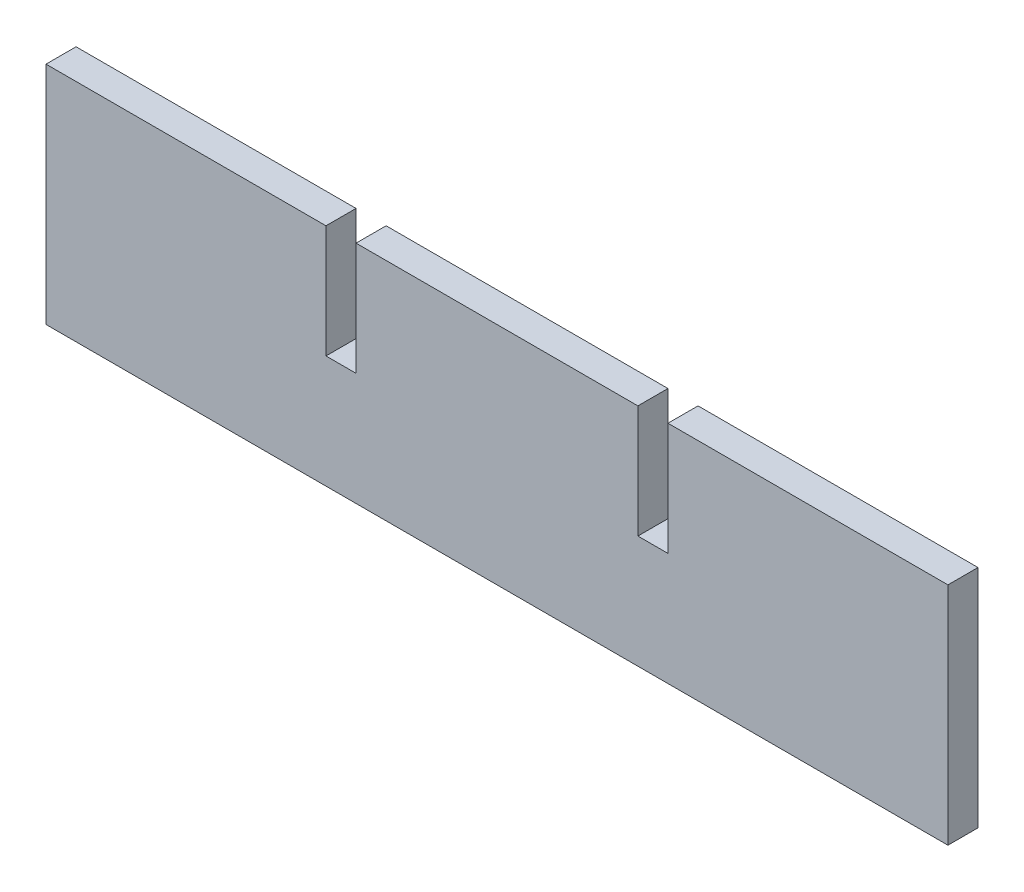
ISO-10303-21;
HEADER;
FILE_DESCRIPTION(('STEP AP214'),'2;1');
FILE_NAME('part.step','',(''),(''),'','','');
FILE_SCHEMA(('AUTOMOTIVE_DESIGN { 1 0 10303 214 1 1 1 1 }'));
ENDSEC;
DATA;
#1=APPLICATION_CONTEXT('core data for automotive mechanical design processes');
#2=APPLICATION_PROTOCOL_DEFINITION('international standard','automotive_design',2000,#1);
#3=PRODUCT_CONTEXT('',#1,'mechanical');
#4=PRODUCT('Part','Part','',(#3));
#5=PRODUCT_RELATED_PRODUCT_CATEGORY('part','',(#4));
#6=PRODUCT_DEFINITION_FORMATION('','',#4);
#7=PRODUCT_DEFINITION_CONTEXT('part definition',#1,'design');
#8=PRODUCT_DEFINITION('design','',#6,#7);
#9=PRODUCT_DEFINITION_SHAPE('','',#8);
#10=(LENGTH_UNIT() NAMED_UNIT(*) SI_UNIT(.MILLI.,.METRE.));
#11=(NAMED_UNIT(*) PLANE_ANGLE_UNIT() SI_UNIT($,.RADIAN.));
#12=(NAMED_UNIT(*) SI_UNIT($,.STERADIAN.) SOLID_ANGLE_UNIT());
#13=UNCERTAINTY_MEASURE_WITH_UNIT(LENGTH_MEASURE(1.E-05),#10,'distance_accuracy_value','');
#14=(GEOMETRIC_REPRESENTATION_CONTEXT(3) GLOBAL_UNCERTAINTY_ASSIGNED_CONTEXT((#13)) GLOBAL_UNIT_ASSIGNED_CONTEXT((#10,
#11,#12)) REPRESENTATION_CONTEXT('',''));
#15=CARTESIAN_POINT('',(0.,0.,0.));
#16=DIRECTION('',(0.,0.,1.));
#17=DIRECTION('',(1.,0.,0.));
#18=AXIS2_PLACEMENT_3D('',#15,#16,#17);
#19=CARTESIAN_POINT('',(-120.,0.,8.));
#20=DIRECTION('',(1.,0.,0.));
#21=DIRECTION('',(0.,0.,-1.));
#22=AXIS2_PLACEMENT_3D('',#19,#20,#21);
#23=PLANE('',#22);
#24=DIRECTION('',(0.,-1.,0.));
#25=VECTOR('',#24,1.);
#26=CARTESIAN_POINT('',(-120.,0.,0.));
#27=LINE('',#26,#25);
#28=CARTESIAN_POINT('',(-120.,60.,0.));
#29=VERTEX_POINT('',#28);
#30=CARTESIAN_POINT('',(-120.,0.,0.));
#31=VERTEX_POINT('',#30);
#32=EDGE_CURVE('E153',#29,#31,#27,.T.);
#33=ORIENTED_EDGE('',*,*,#32,.T.);
#34=DIRECTION('',(0.,0.,-1.));
#35=VECTOR('',#34,1.);
#36=CARTESIAN_POINT('',(-120.,0.,8.));
#37=LINE('',#36,#35);
#38=CARTESIAN_POINT('',(-120.,0.,8.));
#39=VERTEX_POINT('',#38);
#40=EDGE_CURVE('E11',#39,#31,#37,.T.);
#41=ORIENTED_EDGE('',*,*,#40,.F.);
#42=DIRECTION('',(0.,-1.,0.));
#43=VECTOR('',#42,1.);
#44=CARTESIAN_POINT('',(-120.,0.,8.));
#45=LINE('',#44,#43);
#46=CARTESIAN_POINT('',(-120.,60.,8.));
#47=VERTEX_POINT('',#46);
#48=EDGE_CURVE('E175',#47,#39,#45,.T.);
#49=ORIENTED_EDGE('',*,*,#48,.F.);
#50=DIRECTION('',(0.,0.,-1.));
#51=VECTOR('',#50,1.);
#52=CARTESIAN_POINT('',(-120.,60.,8.));
#53=LINE('',#52,#51);
#54=EDGE_CURVE('E149',#47,#29,#53,.T.);
#55=ORIENTED_EDGE('',*,*,#54,.T.);
#56=EDGE_LOOP('',(#33,#41,#49,#55));
#57=FACE_BOUND('',#56,.T.);
#58=ADVANCED_FACE('F33',(#57),#23,.F.);
#59=CARTESIAN_POINT('',(120.,0.,8.));
#60=DIRECTION('',(0.,1.,0.));
#61=DIRECTION('',(0.,0.,1.));
#62=AXIS2_PLACEMENT_3D('',#59,#60,#61);
#63=PLANE('',#62);
#64=DIRECTION('',(1.,0.,0.));
#65=VECTOR('',#64,1.);
#66=CARTESIAN_POINT('',(120.,0.,0.));
#67=LINE('',#66,#65);
#68=CARTESIAN_POINT('',(120.,0.,0.));
#69=VERTEX_POINT('',#68);
#70=EDGE_CURVE('E156',#31,#69,#67,.T.);
#71=ORIENTED_EDGE('',*,*,#70,.T.);
#72=DIRECTION('',(0.,0.,-1.));
#73=VECTOR('',#72,1.);
#74=CARTESIAN_POINT('',(120.,0.,8.));
#75=LINE('',#74,#73);
#76=CARTESIAN_POINT('',(120.,0.,8.));
#77=VERTEX_POINT('',#76);
#78=EDGE_CURVE('E41',#77,#69,#75,.T.);
#79=ORIENTED_EDGE('',*,*,#78,.F.);
#80=DIRECTION('',(1.,0.,0.));
#81=VECTOR('',#80,1.);
#82=CARTESIAN_POINT('',(120.,0.,8.));
#83=LINE('',#82,#81);
#84=EDGE_CURVE('E104',#39,#77,#83,.T.);
#85=ORIENTED_EDGE('',*,*,#84,.F.);
#86=ORIENTED_EDGE('',*,*,#40,.T.);
#87=EDGE_LOOP('',(#71,#79,#85,#86));
#88=FACE_BOUND('',#87,.T.);
#89=ADVANCED_FACE('F253',(#88),#63,.F.);
#90=CARTESIAN_POINT('',(120.,0.,8.));
#91=DIRECTION('',(-1.,0.,0.));
#92=DIRECTION('',(0.,0.,1.));
#93=AXIS2_PLACEMENT_3D('',#90,#91,#92);
#94=PLANE('',#93);
#95=DIRECTION('',(0.,1.,0.));
#96=VECTOR('',#95,1.);
#97=CARTESIAN_POINT('',(120.,0.,0.));
#98=LINE('',#97,#96);
#99=CARTESIAN_POINT('',(120.,60.,0.));
#100=VERTEX_POINT('',#99);
#101=EDGE_CURVE('E158',#69,#100,#98,.T.);
#102=ORIENTED_EDGE('',*,*,#101,.T.);
#103=DIRECTION('',(0.,0.,-1.));
#104=VECTOR('',#103,1.);
#105=CARTESIAN_POINT('',(120.,60.,8.));
#106=LINE('',#105,#104);
#107=CARTESIAN_POINT('',(120.,60.,8.));
#108=VERTEX_POINT('',#107);
#109=EDGE_CURVE('E194',#108,#100,#106,.T.);
#110=ORIENTED_EDGE('',*,*,#109,.F.);
#111=DIRECTION('',(0.,1.,0.));
#112=VECTOR('',#111,1.);
#113=CARTESIAN_POINT('',(120.,0.,8.));
#114=LINE('',#113,#112);
#115=EDGE_CURVE('E202',#77,#108,#114,.T.);
#116=ORIENTED_EDGE('',*,*,#115,.F.);
#117=ORIENTED_EDGE('',*,*,#78,.T.);
#118=EDGE_LOOP('',(#102,#110,#116,#117));
#119=FACE_BOUND('',#118,.T.);
#120=ADVANCED_FACE('F200',(#119),#94,.F.);
#121=CARTESIAN_POINT('',(120.,60.,8.));
#122=DIRECTION('',(0.,-1.,0.));
#123=DIRECTION('',(1.,0.,0.));
#124=AXIS2_PLACEMENT_3D('',#121,#122,#123);
#125=PLANE('',#124);
#126=DIRECTION('',(-1.,0.,0.));
#127=VECTOR('',#126,1.);
#128=CARTESIAN_POINT('',(120.,60.,0.));
#129=LINE('',#128,#127);
#130=CARTESIAN_POINT('',(45.5,60.0000000000002,0.));
#131=VERTEX_POINT('',#130);
#132=EDGE_CURVE('E160',#100,#131,#129,.T.);
#133=ORIENTED_EDGE('',*,*,#132,.T.);
#134=DIRECTION('',(0.,0.,-1.));
#135=VECTOR('',#134,1.);
#136=CARTESIAN_POINT('',(45.5,60.0000000000002,8.));
#137=LINE('',#136,#135);
#138=CARTESIAN_POINT('',(45.5,60.0000000000002,8.));
#139=VERTEX_POINT('',#138);
#140=EDGE_CURVE('E191',#139,#131,#137,.T.);
#141=ORIENTED_EDGE('',*,*,#140,.F.);
#142=DIRECTION('',(-1.,0.,0.));
#143=VECTOR('',#142,1.);
#144=CARTESIAN_POINT('',(120.,60.,8.));
#145=LINE('',#144,#143);
#146=EDGE_CURVE('E220',#108,#139,#145,.T.);
#147=ORIENTED_EDGE('',*,*,#146,.F.);
#148=ORIENTED_EDGE('',*,*,#109,.T.);
#149=EDGE_LOOP('',(#133,#141,#147,#148));
#150=FACE_BOUND('',#149,.T.);
#151=ADVANCED_FACE('F211',(#150),#125,.F.);
#152=CARTESIAN_POINT('',(45.5,60.0000000000002,8.));
#153=DIRECTION('',(1.,0.,0.));
#154=DIRECTION('',(0.,1.,0.));
#155=AXIS2_PLACEMENT_3D('',#152,#153,#154);
#156=PLANE('',#155);
#157=DIRECTION('',(0.,-1.,0.));
#158=VECTOR('',#157,1.);
#159=CARTESIAN_POINT('',(45.5,60.0000000000002,0.));
#160=LINE('',#159,#158);
#161=CARTESIAN_POINT('',(45.5,30.0000000000002,0.));
#162=VERTEX_POINT('',#161);
#163=EDGE_CURVE('E162',#131,#162,#160,.T.);
#164=ORIENTED_EDGE('',*,*,#163,.T.);
#165=DIRECTION('',(0.,0.,-1.));
#166=VECTOR('',#165,1.);
#167=CARTESIAN_POINT('',(45.5,30.0000000000002,8.));
#168=LINE('',#167,#166);
#169=CARTESIAN_POINT('',(45.5,30.0000000000002,8.));
#170=VERTEX_POINT('',#169);
#171=EDGE_CURVE('E188',#170,#162,#168,.T.);
#172=ORIENTED_EDGE('',*,*,#171,.F.);
#173=DIRECTION('',(0.,-1.,0.));
#174=VECTOR('',#173,1.);
#175=CARTESIAN_POINT('',(45.5,60.0000000000002,8.));
#176=LINE('',#175,#174);
#177=EDGE_CURVE('E217',#139,#170,#176,.T.);
#178=ORIENTED_EDGE('',*,*,#177,.F.);
#179=ORIENTED_EDGE('',*,*,#140,.T.);
#180=EDGE_LOOP('',(#164,#172,#178,#179));
#181=FACE_BOUND('',#180,.T.);
#182=ADVANCED_FACE('F215',(#181),#156,.F.);
#183=CARTESIAN_POINT('',(45.5,30.0000000000002,8.));
#184=DIRECTION('',(0.,-1.,0.));
#185=DIRECTION('',(0.,0.,-1.));
#186=AXIS2_PLACEMENT_3D('',#183,#184,#185);
#187=PLANE('',#186);
#188=DIRECTION('',(-1.,0.,0.));
#189=VECTOR('',#188,1.);
#190=CARTESIAN_POINT('',(45.5,30.0000000000002,0.));
#191=LINE('',#190,#189);
#192=CARTESIAN_POINT('',(37.5,30.0000000000002,0.));
#193=VERTEX_POINT('',#192);
#194=EDGE_CURVE('E164',#162,#193,#191,.T.);
#195=ORIENTED_EDGE('',*,*,#194,.T.);
#196=DIRECTION('',(0.,0.,-1.));
#197=VECTOR('',#196,1.);
#198=CARTESIAN_POINT('',(37.5,30.0000000000002,8.));
#199=LINE('',#198,#197);
#200=CARTESIAN_POINT('',(37.5,30.0000000000002,8.));
#201=VERTEX_POINT('',#200);
#202=EDGE_CURVE('E185',#201,#193,#199,.T.);
#203=ORIENTED_EDGE('',*,*,#202,.F.);
#204=DIRECTION('',(-1.,0.,0.));
#205=VECTOR('',#204,1.);
#206=CARTESIAN_POINT('',(45.5,30.0000000000002,8.));
#207=LINE('',#206,#205);
#208=EDGE_CURVE('E219',#170,#201,#207,.T.);
#209=ORIENTED_EDGE('',*,*,#208,.F.);
#210=ORIENTED_EDGE('',*,*,#171,.T.);
#211=EDGE_LOOP('',(#195,#203,#209,#210));
#212=FACE_BOUND('',#211,.T.);
#213=ADVANCED_FACE('F266',(#212),#187,.F.);
#214=CARTESIAN_POINT('',(37.5,30.0000000000002,8.));
#215=DIRECTION('',(-1.,0.,0.));
#216=DIRECTION('',(0.,-1.,0.));
#217=AXIS2_PLACEMENT_3D('',#214,#215,#216);
#218=PLANE('',#217);
#219=DIRECTION('',(0.,1.,0.));
#220=VECTOR('',#219,1.);
#221=CARTESIAN_POINT('',(37.5,30.0000000000002,0.));
#222=LINE('',#221,#220);
#223=CARTESIAN_POINT('',(37.5,60.0000000000002,0.));
#224=VERTEX_POINT('',#223);
#225=EDGE_CURVE('E166',#193,#224,#222,.T.);
#226=ORIENTED_EDGE('',*,*,#225,.T.);
#227=DIRECTION('',(0.,0.,-1.));
#228=VECTOR('',#227,1.);
#229=CARTESIAN_POINT('',(37.5,60.0000000000002,8.));
#230=LINE('',#229,#228);
#231=CARTESIAN_POINT('',(37.5,60.0000000000002,8.));
#232=VERTEX_POINT('',#231);
#233=EDGE_CURVE('E182',#232,#224,#230,.T.);
#234=ORIENTED_EDGE('',*,*,#233,.F.);
#235=DIRECTION('',(0.,1.,0.));
#236=VECTOR('',#235,1.);
#237=CARTESIAN_POINT('',(37.5,30.0000000000002,8.));
#238=LINE('',#237,#236);
#239=EDGE_CURVE('E222',#201,#232,#238,.T.);
#240=ORIENTED_EDGE('',*,*,#239,.F.);
#241=ORIENTED_EDGE('',*,*,#202,.T.);
#242=EDGE_LOOP('',(#226,#234,#240,#241));
#243=FACE_BOUND('',#242,.T.);
#244=ADVANCED_FACE('F269',(#243),#218,.F.);
#245=CARTESIAN_POINT('',(-37.5,60.0000000000002,8.));
#246=DIRECTION('',(0.,-1.,0.));
#247=DIRECTION('',(0.,0.,-1.));
#248=AXIS2_PLACEMENT_3D('',#245,#246,#247);
#249=PLANE('',#248);
#250=DIRECTION('',(-1.,0.,0.));
#251=VECTOR('',#250,1.);
#252=CARTESIAN_POINT('',(-37.5,60.0000000000002,0.));
#253=LINE('',#252,#251);
#254=CARTESIAN_POINT('',(-37.5,60.0000000000002,0.));
#255=VERTEX_POINT('',#254);
#256=EDGE_CURVE('E168',#224,#255,#253,.T.);
#257=ORIENTED_EDGE('',*,*,#256,.T.);
#258=DIRECTION('',(0.,0.,-1.));
#259=VECTOR('',#258,1.);
#260=CARTESIAN_POINT('',(-37.5,60.0000000000002,8.));
#261=LINE('',#260,#259);
#262=CARTESIAN_POINT('',(-37.5,60.0000000000002,8.));
#263=VERTEX_POINT('',#262);
#264=EDGE_CURVE('E179',#263,#255,#261,.T.);
#265=ORIENTED_EDGE('',*,*,#264,.F.);
#266=DIRECTION('',(-1.,0.,0.));
#267=VECTOR('',#266,1.);
#268=CARTESIAN_POINT('',(-37.5,60.0000000000002,8.));
#269=LINE('',#268,#267);
#270=EDGE_CURVE('E228',#232,#263,#269,.T.);
#271=ORIENTED_EDGE('',*,*,#270,.F.);
#272=ORIENTED_EDGE('',*,*,#233,.T.);
#273=EDGE_LOOP('',(#257,#265,#271,#272));
#274=FACE_BOUND('',#273,.T.);
#275=ADVANCED_FACE('F234',(#274),#249,.F.);
#276=CARTESIAN_POINT('',(-37.5,30.0000000000002,8.));
#277=DIRECTION('',(1.,0.,0.));
#278=DIRECTION('',(0.,1.,0.));
#279=AXIS2_PLACEMENT_3D('',#276,#277,#278);
#280=PLANE('',#279);
#281=DIRECTION('',(0.,-1.,0.));
#282=VECTOR('',#281,1.);
#283=CARTESIAN_POINT('',(-37.5,30.0000000000002,0.));
#284=LINE('',#283,#282);
#285=CARTESIAN_POINT('',(-37.5,30.0000000000002,0.));
#286=VERTEX_POINT('',#285);
#287=EDGE_CURVE('E170',#255,#286,#284,.T.);
#288=ORIENTED_EDGE('',*,*,#287,.T.);
#289=DIRECTION('',(0.,0.,-1.));
#290=VECTOR('',#289,1.);
#291=CARTESIAN_POINT('',(-37.5,30.0000000000002,8.));
#292=LINE('',#291,#290);
#293=CARTESIAN_POINT('',(-37.5,30.0000000000002,8.));
#294=VERTEX_POINT('',#293);
#295=EDGE_CURVE('E144',#294,#286,#292,.T.);
#296=ORIENTED_EDGE('',*,*,#295,.F.);
#297=DIRECTION('',(0.,-1.,0.));
#298=VECTOR('',#297,1.);
#299=CARTESIAN_POINT('',(-37.5,30.0000000000002,8.));
#300=LINE('',#299,#298);
#301=EDGE_CURVE('E135',#263,#294,#300,.T.);
#302=ORIENTED_EDGE('',*,*,#301,.F.);
#303=ORIENTED_EDGE('',*,*,#264,.T.);
#304=EDGE_LOOP('',(#288,#296,#302,#303));
#305=FACE_BOUND('',#304,.T.);
#306=ADVANCED_FACE('F238',(#305),#280,.F.);
#307=CARTESIAN_POINT('',(-45.5,30.0000000000002,8.));
#308=DIRECTION('',(0.,-1.,0.));
#309=DIRECTION('',(0.,0.,-1.));
#310=AXIS2_PLACEMENT_3D('',#307,#308,#309);
#311=PLANE('',#310);
#312=DIRECTION('',(-1.,0.,0.));
#313=VECTOR('',#312,1.);
#314=CARTESIAN_POINT('',(-45.5,30.0000000000002,0.));
#315=LINE('',#314,#313);
#316=CARTESIAN_POINT('',(-45.5,30.0000000000002,0.));
#317=VERTEX_POINT('',#316);
#318=EDGE_CURVE('E143',#286,#317,#315,.T.);
#319=ORIENTED_EDGE('',*,*,#318,.T.);
#320=DIRECTION('',(0.,0.,-1.));
#321=VECTOR('',#320,1.);
#322=CARTESIAN_POINT('',(-45.5,30.0000000000002,8.));
#323=LINE('',#322,#321);
#324=CARTESIAN_POINT('',(-45.5,30.0000000000002,8.));
#325=VERTEX_POINT('',#324);
#326=EDGE_CURVE('E140',#325,#317,#323,.T.);
#327=ORIENTED_EDGE('',*,*,#326,.F.);
#328=DIRECTION('',(-1.,0.,0.));
#329=VECTOR('',#328,1.);
#330=CARTESIAN_POINT('',(-45.5,30.0000000000002,8.));
#331=LINE('',#330,#329);
#332=EDGE_CURVE('E129',#294,#325,#331,.T.);
#333=ORIENTED_EDGE('',*,*,#332,.F.);
#334=ORIENTED_EDGE('',*,*,#295,.T.);
#335=EDGE_LOOP('',(#319,#327,#333,#334));
#336=FACE_BOUND('',#335,.T.);
#337=ADVANCED_FACE('F141',(#336),#311,.F.);
#338=CARTESIAN_POINT('',(-45.5,60.0000000000002,8.));
#339=DIRECTION('',(-1.,0.,0.));
#340=DIRECTION('',(0.,-1.,0.));
#341=AXIS2_PLACEMENT_3D('',#338,#339,#340);
#342=PLANE('',#341);
#343=DIRECTION('',(0.,1.,0.));
#344=VECTOR('',#343,1.);
#345=CARTESIAN_POINT('',(-45.5,60.0000000000002,0.));
#346=LINE('',#345,#344);
#347=CARTESIAN_POINT('',(-45.5,60.0000000000002,0.));
#348=VERTEX_POINT('',#347);
#349=EDGE_CURVE('E90',#317,#348,#346,.T.);
#350=ORIENTED_EDGE('',*,*,#349,.T.);
#351=DIRECTION('',(0.,0.,-1.));
#352=VECTOR('',#351,1.);
#353=CARTESIAN_POINT('',(-45.5,60.0000000000002,8.));
#354=LINE('',#353,#352);
#355=CARTESIAN_POINT('',(-45.5,60.0000000000002,8.));
#356=VERTEX_POINT('',#355);
#357=EDGE_CURVE('E145',#356,#348,#354,.T.);
#358=ORIENTED_EDGE('',*,*,#357,.F.);
#359=DIRECTION('',(0.,1.,0.));
#360=VECTOR('',#359,1.);
#361=CARTESIAN_POINT('',(-45.5,60.0000000000002,8.));
#362=LINE('',#361,#360);
#363=EDGE_CURVE('E133',#325,#356,#362,.T.);
#364=ORIENTED_EDGE('',*,*,#363,.F.);
#365=ORIENTED_EDGE('',*,*,#326,.T.);
#366=EDGE_LOOP('',(#350,#358,#364,#365));
#367=FACE_BOUND('',#366,.T.);
#368=ADVANCED_FACE('F147',(#367),#342,.F.);
#369=CARTESIAN_POINT('',(-120.,60.,8.));
#370=DIRECTION('',(0.,-1.,0.));
#371=DIRECTION('',(1.,0.,0.));
#372=AXIS2_PLACEMENT_3D('',#369,#370,#371);
#373=PLANE('',#372);
#374=DIRECTION('',(-1.,0.,0.));
#375=VECTOR('',#374,1.);
#376=CARTESIAN_POINT('',(-120.,60.,0.));
#377=LINE('',#376,#375);
#378=EDGE_CURVE('E96',#348,#29,#377,.T.);
#379=ORIENTED_EDGE('',*,*,#378,.T.);
#380=ORIENTED_EDGE('',*,*,#54,.F.);
#381=DIRECTION('',(-1.,0.,0.));
#382=VECTOR('',#381,1.);
#383=CARTESIAN_POINT('',(-120.,60.,8.));
#384=LINE('',#383,#382);
#385=EDGE_CURVE('E49',#356,#47,#384,.T.);
#386=ORIENTED_EDGE('',*,*,#385,.F.);
#387=ORIENTED_EDGE('',*,*,#357,.T.);
#388=EDGE_LOOP('',(#379,#380,#386,#387));
#389=FACE_BOUND('',#388,.T.);
#390=ADVANCED_FACE('F242',(#389),#373,.F.);
#391=CARTESIAN_POINT('',(0.,0.,8.));
#392=DIRECTION('',(0.,0.,-1.));
#393=DIRECTION('',(-1.,0.,0.));
#394=AXIS2_PLACEMENT_3D('',#391,#392,#393);
#395=PLANE('',#394);
#396=ORIENTED_EDGE('',*,*,#48,.T.);
#397=ORIENTED_EDGE('',*,*,#84,.T.);
#398=ORIENTED_EDGE('',*,*,#115,.T.);
#399=ORIENTED_EDGE('',*,*,#146,.T.);
#400=ORIENTED_EDGE('',*,*,#177,.T.);
#401=ORIENTED_EDGE('',*,*,#208,.T.);
#402=ORIENTED_EDGE('',*,*,#239,.T.);
#403=ORIENTED_EDGE('',*,*,#270,.T.);
#404=ORIENTED_EDGE('',*,*,#301,.T.);
#405=ORIENTED_EDGE('',*,*,#332,.T.);
#406=ORIENTED_EDGE('',*,*,#363,.T.);
#407=ORIENTED_EDGE('',*,*,#385,.T.);
#408=EDGE_LOOP('',(#396,#397,#398,#399,#400,#401,#402,#403,#404,#405,#406,#407));
#409=FACE_BOUND('',#408,.T.);
#410=ADVANCED_FACE('F131',(#409),#395,.F.);
#411=CARTESIAN_POINT('',(0.,0.,0.));
#412=DIRECTION('',(0.,0.,-1.));
#413=DIRECTION('',(-1.,0.,0.));
#414=AXIS2_PLACEMENT_3D('',#411,#412,#413);
#415=PLANE('',#414);
#416=ORIENTED_EDGE('',*,*,#32,.F.);
#417=ORIENTED_EDGE('',*,*,#378,.F.);
#418=ORIENTED_EDGE('',*,*,#349,.F.);
#419=ORIENTED_EDGE('',*,*,#318,.F.);
#420=ORIENTED_EDGE('',*,*,#287,.F.);
#421=ORIENTED_EDGE('',*,*,#256,.F.);
#422=ORIENTED_EDGE('',*,*,#225,.F.);
#423=ORIENTED_EDGE('',*,*,#194,.F.);
#424=ORIENTED_EDGE('',*,*,#163,.F.);
#425=ORIENTED_EDGE('',*,*,#132,.F.);
#426=ORIENTED_EDGE('',*,*,#101,.F.);
#427=ORIENTED_EDGE('',*,*,#70,.F.);
#428=EDGE_LOOP('',(#416,#417,#418,#419,#420,#421,#422,#423,#424,#425,#426,#427));
#429=FACE_BOUND('',#428,.T.);
#430=ADVANCED_FACE('F206',(#429),#415,.T.);
#431=CLOSED_SHELL('',(#58,#89,#120,#151,#182,#213,#244,#275,#306,#337,#368,#390,#410,#430));
#432=MANIFOLD_SOLID_BREP('B2',#431);
#433=ADVANCED_BREP_SHAPE_REPRESENTATION('',(#18,#432),#14);
#434=SHAPE_DEFINITION_REPRESENTATION(#9,#433);
ENDSEC;
END-ISO-10303-21;
